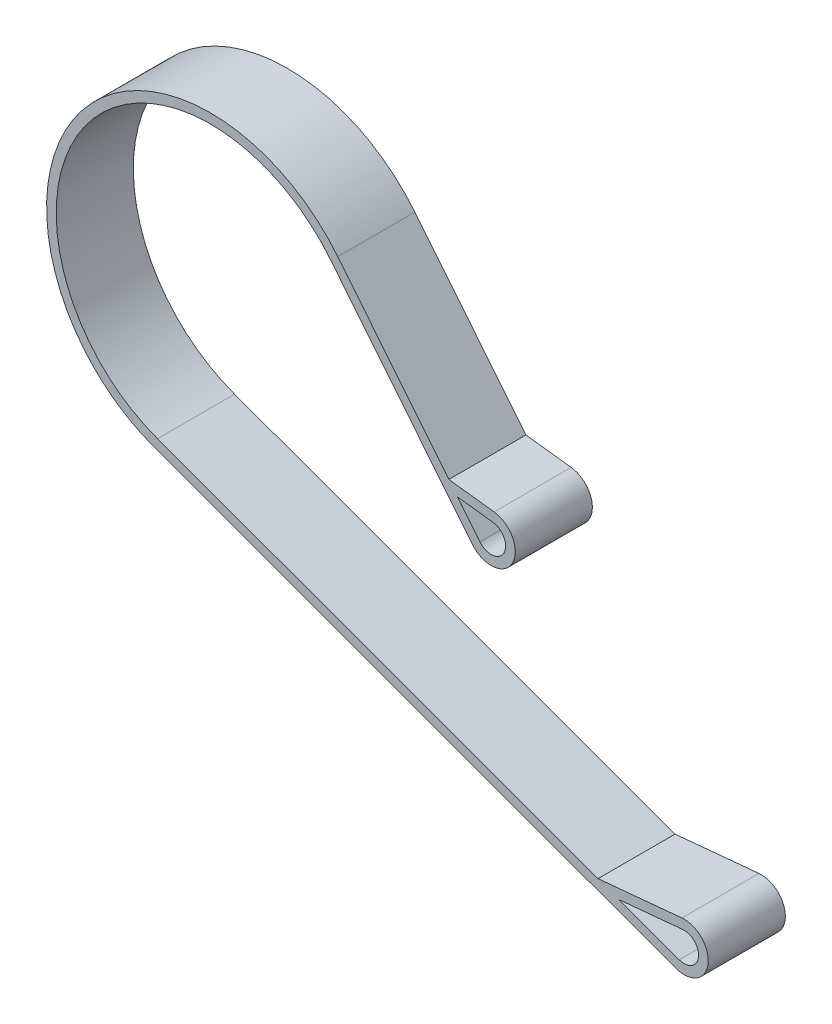
ISO-10303-21;
HEADER;
FILE_DESCRIPTION(('STEP AP214'),'2;1');
FILE_NAME('part.step','',(''),(''),'','','');
FILE_SCHEMA(('AUTOMOTIVE_DESIGN { 1 0 10303 214 1 1 1 1 }'));
ENDSEC;
DATA;
#1=APPLICATION_CONTEXT('core data for automotive mechanical design processes');
#2=APPLICATION_PROTOCOL_DEFINITION('international standard','automotive_design',2000,#1);
#3=PRODUCT_CONTEXT('',#1,'mechanical');
#4=PRODUCT('Part','Part','',(#3));
#5=PRODUCT_RELATED_PRODUCT_CATEGORY('part','',(#4));
#6=PRODUCT_DEFINITION_FORMATION('','',#4);
#7=PRODUCT_DEFINITION_CONTEXT('part definition',#1,'design');
#8=PRODUCT_DEFINITION('design','',#6,#7);
#9=PRODUCT_DEFINITION_SHAPE('','',#8);
#10=(LENGTH_UNIT() NAMED_UNIT(*) SI_UNIT(.MILLI.,.METRE.));
#11=(NAMED_UNIT(*) PLANE_ANGLE_UNIT() SI_UNIT($,.RADIAN.));
#12=(NAMED_UNIT(*) SI_UNIT($,.STERADIAN.) SOLID_ANGLE_UNIT());
#13=UNCERTAINTY_MEASURE_WITH_UNIT(LENGTH_MEASURE(1.E-05),#10,'distance_accuracy_value','');
#14=(GEOMETRIC_REPRESENTATION_CONTEXT(3) GLOBAL_UNCERTAINTY_ASSIGNED_CONTEXT((#13)) GLOBAL_UNIT_ASSIGNED_CONTEXT((#10,
#11,#12)) REPRESENTATION_CONTEXT('',''));
#15=CARTESIAN_POINT('',(0.,0.,0.));
#16=DIRECTION('',(0.,0.,1.));
#17=DIRECTION('',(1.,0.,0.));
#18=AXIS2_PLACEMENT_3D('',#15,#16,#17);
#19=CARTESIAN_POINT('',(-302.042094367227,-513.78392428085,25.4));
#20=DIRECTION('',(0.342935108897549,0.939359095918822,0.));
#21=DIRECTION('',(-0.939359095918822,0.342935108897549,0.));
#22=AXIS2_PLACEMENT_3D('',#19,#20,#21);
#23=PLANE('',#22);
#24=DIRECTION('',(0.939359095918822,-0.342935108897549,0.));
#25=VECTOR('',#24,1.);
#26=CARTESIAN_POINT('',(-302.042094367227,-513.78392428085,0.));
#27=LINE('',#26,#25);
#28=CARTESIAN_POINT('',(-149.967144558196,-569.302457821357,0.));
#29=VERTEX_POINT('',#28);
#30=CARTESIAN_POINT('',(-130.145681642796,-576.538748578463,0.));
#31=VERTEX_POINT('',#30);
#32=EDGE_CURVE('E171',#29,#31,#27,.T.);
#33=ORIENTED_EDGE('',*,*,#32,.F.);
#34=DIRECTION('',(0.,0.,-1.));
#35=VECTOR('',#34,1.);
#36=CARTESIAN_POINT('',(-149.967144558196,-569.302457821357,0.));
#37=LINE('',#36,#35);
#38=CARTESIAN_POINT('',(-149.967144558196,-569.302457821357,25.4));
#39=VERTEX_POINT('',#38);
#40=EDGE_CURVE('E155',#39,#29,#37,.T.);
#41=ORIENTED_EDGE('',*,*,#40,.F.);
#42=DIRECTION('',(0.939359095918822,-0.342935108897549,0.));
#43=VECTOR('',#42,1.);
#44=CARTESIAN_POINT('',(-302.042094367227,-513.78392428085,25.4));
#45=LINE('',#44,#43);
#46=CARTESIAN_POINT('',(-130.145681642796,-576.538748578463,25.4));
#47=VERTEX_POINT('',#46);
#48=EDGE_CURVE('E254',#39,#47,#45,.T.);
#49=ORIENTED_EDGE('',*,*,#48,.T.);
#50=DIRECTION('',(0.,0.,-1.));
#51=VECTOR('',#50,1.);
#52=CARTESIAN_POINT('',(-130.145681642796,-576.538748578463,25.4));
#53=LINE('',#52,#51);
#54=EDGE_CURVE('E217',#47,#31,#53,.T.);
#55=ORIENTED_EDGE('',*,*,#54,.T.);
#56=EDGE_LOOP('',(#33,#41,#49,#55));
#57=FACE_BOUND('',#56,.T.);
#58=ADVANCED_FACE('F33',(#57),#23,.T.);
#59=CARTESIAN_POINT('',(-302.042094367227,-513.78392428085,25.4));
#60=VERTEX_POINT('',#59);
#61=CARTESIAN_POINT('',(-156.910869565258,-566.767487859606,25.4));
#62=VERTEX_POINT('',#61);
#63=EDGE_CURVE('E164',#60,#62,#45,.T.);
#64=ORIENTED_EDGE('',*,*,#63,.T.);
#65=DIRECTION('',(0.,0.,1.));
#66=VECTOR('',#65,1.);
#67=CARTESIAN_POINT('',(-156.910869565258,-566.767487859606,25.4));
#68=LINE('',#67,#66);
#69=CARTESIAN_POINT('',(-156.910869565258,-566.767487859606,0.));
#70=VERTEX_POINT('',#69);
#71=EDGE_CURVE('E148',#70,#62,#68,.T.);
#72=ORIENTED_EDGE('',*,*,#71,.F.);
#73=CARTESIAN_POINT('',(-302.042094367227,-513.78392428085,0.));
#74=VERTEX_POINT('',#73);
#75=EDGE_CURVE('E161',#74,#70,#27,.T.);
#76=ORIENTED_EDGE('',*,*,#75,.F.);
#77=DIRECTION('',(0.,0.,-1.));
#78=VECTOR('',#77,1.);
#79=CARTESIAN_POINT('',(-302.042094367227,-513.78392428085,25.4));
#80=LINE('',#79,#78);
#81=EDGE_CURVE('E215',#60,#74,#80,.T.);
#82=ORIENTED_EDGE('',*,*,#81,.F.);
#83=EDGE_LOOP('',(#64,#72,#76,#82));
#84=FACE_BOUND('',#83,.T.);
#85=ADVANCED_FACE('F160',(#84),#23,.T.);
#86=CARTESIAN_POINT('',(-242.638589895451,-432.141353868772,25.4));
#87=DIRECTION('',(-0.777811967388241,-0.628497051216339,0.));
#88=DIRECTION('',(0.62849705121634,-0.777811967388241,0.));
#89=AXIS2_PLACEMENT_3D('',#86,#87,#88);
#90=PLANE('',#89);
#91=DIRECTION('',(0.,0.,-1.));
#92=VECTOR('',#91,1.);
#93=CARTESIAN_POINT('',(-206.046345314142,-477.426985191714,25.4));
#94=LINE('',#93,#92);
#95=CARTESIAN_POINT('',(-206.046345314142,-477.426985191714,25.4));
#96=VERTEX_POINT('',#95);
#97=CARTESIAN_POINT('',(-206.046345314142,-477.426985191714,0.));
#98=VERTEX_POINT('',#97);
#99=EDGE_CURVE('E260',#96,#98,#94,.T.);
#100=ORIENTED_EDGE('',*,*,#99,.T.);
#101=DIRECTION('',(-0.62849705121634,0.777811967388241,0.));
#102=VECTOR('',#101,1.);
#103=CARTESIAN_POINT('',(-242.638589895451,-432.141353868772,0.));
#104=LINE('',#103,#102);
#105=CARTESIAN_POINT('',(-242.638589895451,-432.141353868772,0.));
#106=VERTEX_POINT('',#105);
#107=EDGE_CURVE('E185',#98,#106,#104,.T.);
#108=ORIENTED_EDGE('',*,*,#107,.T.);
#109=DIRECTION('',(0.,0.,-1.));
#110=VECTOR('',#109,1.);
#111=CARTESIAN_POINT('',(-242.638589895451,-432.141353868772,25.4));
#112=LINE('',#111,#110);
#113=CARTESIAN_POINT('',(-242.638589895451,-432.141353868772,25.4));
#114=VERTEX_POINT('',#113);
#115=EDGE_CURVE('E200',#114,#106,#112,.T.);
#116=ORIENTED_EDGE('',*,*,#115,.F.);
#117=DIRECTION('',(-0.62849705121634,0.777811967388241,0.));
#118=VECTOR('',#117,1.);
#119=CARTESIAN_POINT('',(-242.638589895451,-432.141353868772,25.4));
#120=LINE('',#119,#118);
#121=EDGE_CURVE('E56',#96,#114,#120,.T.);
#122=ORIENTED_EDGE('',*,*,#121,.F.);
#123=EDGE_LOOP('',(#100,#108,#116,#122));
#124=FACE_BOUND('',#123,.T.);
#125=ADVANCED_FACE('F317',(#124),#90,.F.);
#126=DIRECTION('',(0.,0.,1.));
#127=VECTOR('',#126,1.);
#128=CARTESIAN_POINT('',(-203.182116863291,-480.971681482802,0.));
#129=LINE('',#128,#127);
#130=CARTESIAN_POINT('',(-203.182116863291,-480.971681482802,0.));
#131=VERTEX_POINT('',#130);
#132=CARTESIAN_POINT('',(-203.182116863291,-480.971681482802,25.4));
#133=VERTEX_POINT('',#132);
#134=EDGE_CURVE('E258',#131,#133,#129,.T.);
#135=ORIENTED_EDGE('',*,*,#134,.T.);
#136=CARTESIAN_POINT('',(-195.803695157006,-490.103028547166,25.4));
#137=VERTEX_POINT('',#136);
#138=EDGE_CURVE('E239',#137,#133,#120,.T.);
#139=ORIENTED_EDGE('',*,*,#138,.F.);
#140=DIRECTION('',(0.,0.,-1.));
#141=VECTOR('',#140,1.);
#142=CARTESIAN_POINT('',(-195.803695157006,-490.103028547166,25.4));
#143=LINE('',#142,#141);
#144=CARTESIAN_POINT('',(-195.803695157006,-490.103028547166,0.));
#145=VERTEX_POINT('',#144);
#146=EDGE_CURVE('E203',#137,#145,#143,.T.);
#147=ORIENTED_EDGE('',*,*,#146,.T.);
#148=EDGE_CURVE('E186',#145,#131,#104,.T.);
#149=ORIENTED_EDGE('',*,*,#148,.T.);
#150=EDGE_LOOP('',(#135,#139,#147,#149));
#151=FACE_BOUND('',#150,.T.);
#152=ADVANCED_FACE('F300',(#151),#90,.F.);
#153=CARTESIAN_POINT('',(-128.512453186671,-572.06505088415,25.4));
#154=DIRECTION('',(0.,0.,-1.));
#155=DIRECTION('',(-1.,0.,0.));
#156=AXIS2_PLACEMENT_3D('',#153,#154,#155);
#157=CYLINDRICAL_SURFACE('',#156,7.93750000000008);
#158=CARTESIAN_POINT('',(-128.512453186671,-572.06505088415,0.));
#159=DIRECTION('',(0.,0.,1.));
#160=DIRECTION('',(1.,0.,0.));
#161=AXIS2_PLACEMENT_3D('',#158,#159,#160);
#162=CIRCLE('',#161,7.93750000000008);
#163=CARTESIAN_POINT('',(-131.234500613546,-579.521213708006,0.));
#164=VERTEX_POINT('',#163);
#165=CARTESIAN_POINT('',(-129.256854736989,-564.162534033052,0.));
#166=VERTEX_POINT('',#165);
#167=EDGE_CURVE('E230',#164,#166,#162,.T.);
#168=ORIENTED_EDGE('',*,*,#167,.T.);
#169=DIRECTION('',(0.,0.,-1.));
#170=VECTOR('',#169,1.);
#171=CARTESIAN_POINT('',(-129.256854736989,-564.162534033052,25.4));
#172=LINE('',#171,#170);
#173=CARTESIAN_POINT('',(-129.256854736989,-564.162534033052,25.4));
#174=VERTEX_POINT('',#173);
#175=EDGE_CURVE('E11',#174,#166,#172,.T.);
#176=ORIENTED_EDGE('',*,*,#175,.F.);
#177=CARTESIAN_POINT('',(-128.512453186671,-572.06505088415,25.4));
#178=DIRECTION('',(0.,0.,1.));
#179=DIRECTION('',(1.,0.,0.));
#180=AXIS2_PLACEMENT_3D('',#177,#178,#179);
#181=CIRCLE('',#180,7.93750000000008);
#182=CARTESIAN_POINT('',(-131.234500613546,-579.521213708006,25.4));
#183=VERTEX_POINT('',#182);
#184=EDGE_CURVE('E192',#183,#174,#181,.T.);
#185=ORIENTED_EDGE('',*,*,#184,.F.);
#186=DIRECTION('',(0.,0.,-1.));
#187=VECTOR('',#186,1.);
#188=CARTESIAN_POINT('',(-131.234500613546,-579.521213708006,25.4));
#189=LINE('',#188,#187);
#190=EDGE_CURVE('E193',#183,#164,#189,.T.);
#191=ORIENTED_EDGE('',*,*,#190,.T.);
#192=EDGE_LOOP('',(#168,#176,#185,#191));
#193=FACE_BOUND('',#192,.T.);
#194=ADVANCED_FACE('F35',(#193),#157,.T.);
#195=CARTESIAN_POINT('',(-128.512453186671,-572.06505088415,25.4));
#196=DIRECTION('',(0.,0.,-1.));
#197=DIRECTION('',(-1.,0.,0.));
#198=AXIS2_PLACEMENT_3D('',#195,#196,#197);
#199=CYLINDRICAL_SURFACE('',#198,4.76250000000008);
#200=CARTESIAN_POINT('',(-128.512453186671,-572.06505088415,0.));
#201=DIRECTION('',(0.,0.,1.));
#202=DIRECTION('',(1.,0.,0.));
#203=AXIS2_PLACEMENT_3D('',#200,#201,#202);
#204=CIRCLE('',#203,4.76250000000008);
#205=CARTESIAN_POINT('',(-128.959094116862,-567.323540773491,0.));
#206=VERTEX_POINT('',#205);
#207=EDGE_CURVE('E175',#31,#206,#204,.T.);
#208=ORIENTED_EDGE('',*,*,#207,.F.);
#209=ORIENTED_EDGE('',*,*,#54,.F.);
#210=CARTESIAN_POINT('',(-128.512453186671,-572.06505088415,25.4));
#211=DIRECTION('',(0.,0.,1.));
#212=DIRECTION('',(1.,0.,0.));
#213=AXIS2_PLACEMENT_3D('',#210,#211,#212);
#214=CIRCLE('',#213,4.76250000000008);
#215=CARTESIAN_POINT('',(-128.959094116862,-567.323540773491,25.4));
#216=VERTEX_POINT('',#215);
#217=EDGE_CURVE('E227',#47,#216,#214,.T.);
#218=ORIENTED_EDGE('',*,*,#217,.T.);
#219=DIRECTION('',(0.,0.,-1.));
#220=VECTOR('',#219,1.);
#221=CARTESIAN_POINT('',(-128.959094116862,-567.323540773491,25.4));
#222=LINE('',#221,#220);
#223=EDGE_CURVE('E41',#216,#206,#222,.T.);
#224=ORIENTED_EDGE('',*,*,#223,.T.);
#225=EDGE_LOOP('',(#208,#209,#218,#224));
#226=FACE_BOUND('',#225,.T.);
#227=ADVANCED_FACE('F224',(#226),#199,.F.);
#228=CARTESIAN_POINT('',(-284.620990835231,-466.064482208174,25.4));
#229=DIRECTION('',(0.,0.,-1.));
#230=DIRECTION('',(-1.,0.,0.));
#231=AXIS2_PLACEMENT_3D('',#228,#229,#230);
#232=CYLINDRICAL_SURFACE('',#231,50.7999999999997);
#233=CARTESIAN_POINT('',(-284.620990835231,-466.064482208174,0.));
#234=DIRECTION('',(0.,0.,1.));
#235=DIRECTION('',(1.,0.,0.));
#236=AXIS2_PLACEMENT_3D('',#233,#234,#235);
#237=CIRCLE('',#236,50.7999999999997);
#238=CARTESIAN_POINT('',(-245.108142891909,-434.136832006384,0.));
#239=VERTEX_POINT('',#238);
#240=EDGE_CURVE('E170',#239,#74,#237,.T.);
#241=ORIENTED_EDGE('',*,*,#240,.F.);
#242=DIRECTION('',(0.,0.,-1.));
#243=VECTOR('',#242,1.);
#244=CARTESIAN_POINT('',(-245.108142891909,-434.136832006384,25.4));
#245=LINE('',#244,#243);
#246=CARTESIAN_POINT('',(-245.108142891909,-434.136832006384,25.4));
#247=VERTEX_POINT('',#246);
#248=EDGE_CURVE('E213',#247,#239,#245,.T.);
#249=ORIENTED_EDGE('',*,*,#248,.F.);
#250=CARTESIAN_POINT('',(-284.620990835231,-466.064482208174,25.4));
#251=DIRECTION('',(0.,0.,1.));
#252=DIRECTION('',(1.,0.,0.));
#253=AXIS2_PLACEMENT_3D('',#250,#251,#252);
#254=CIRCLE('',#253,50.7999999999997);
#255=EDGE_CURVE('E250',#247,#60,#254,.T.);
#256=ORIENTED_EDGE('',*,*,#255,.T.);
#257=ORIENTED_EDGE('',*,*,#81,.T.);
#258=EDGE_LOOP('',(#241,#249,#256,#257));
#259=FACE_BOUND('',#258,.T.);
#260=ADVANCED_FACE('F319',(#259),#232,.F.);
#261=CARTESIAN_POINT('',(-245.108142891909,-434.136832006384,25.4));
#262=DIRECTION('',(-0.777811967388241,-0.628497051216339,0.));
#263=DIRECTION('',(0.62849705121634,-0.777811967388241,0.));
#264=AXIS2_PLACEMENT_3D('',#261,#262,#263);
#265=PLANE('',#264);
#266=DIRECTION('',(-0.628497051216339,0.777811967388241,0.));
#267=VECTOR('',#266,1.);
#268=CARTESIAN_POINT('',(-245.108142891909,-434.136832006384,0.));
#269=LINE('',#268,#267);
#270=CARTESIAN_POINT('',(-198.273248153464,-492.098506684778,0.));
#271=VERTEX_POINT('',#270);
#272=EDGE_CURVE('E173',#271,#239,#269,.T.);
#273=ORIENTED_EDGE('',*,*,#272,.F.);
#274=DIRECTION('',(0.,0.,-1.));
#275=VECTOR('',#274,1.);
#276=CARTESIAN_POINT('',(-198.273248153464,-492.098506684778,25.4));
#277=LINE('',#276,#275);
#278=CARTESIAN_POINT('',(-198.273248153464,-492.098506684778,25.4));
#279=VERTEX_POINT('',#278);
#280=EDGE_CURVE('E211',#279,#271,#277,.T.);
#281=ORIENTED_EDGE('',*,*,#280,.F.);
#282=DIRECTION('',(-0.628497051216339,0.777811967388241,0.));
#283=VECTOR('',#282,1.);
#284=CARTESIAN_POINT('',(-245.108142891909,-434.136832006384,25.4));
#285=LINE('',#284,#283);
#286=EDGE_CURVE('E247',#279,#247,#285,.T.);
#287=ORIENTED_EDGE('',*,*,#286,.T.);
#288=ORIENTED_EDGE('',*,*,#248,.T.);
#289=EDGE_LOOP('',(#273,#281,#287,#288));
#290=FACE_BOUND('',#289,.T.);
#291=ADVANCED_FACE('F326',(#290),#265,.T.);
#292=CARTESIAN_POINT('',(-192.099365662319,-487.109811340748,25.4));
#293=DIRECTION('',(0.,0.,-1.));
#294=DIRECTION('',(-1.,0.,0.));
#295=AXIS2_PLACEMENT_3D('',#292,#293,#294);
#296=CYLINDRICAL_SURFACE('',#295,7.93750000000003);
#297=CARTESIAN_POINT('',(-192.099365662319,-487.109811340748,0.));
#298=DIRECTION('',(0.,0.,-1.));
#299=DIRECTION('',(1.,0.,0.));
#300=AXIS2_PLACEMENT_3D('',#297,#298,#299);
#301=CIRCLE('',#300,7.93750000000003);
#302=CARTESIAN_POINT('',(-191.145962890009,-479.229777749211,0.));
#303=VERTEX_POINT('',#302);
#304=EDGE_CURVE('E180',#303,#271,#301,.T.);
#305=ORIENTED_EDGE('',*,*,#304,.F.);
#306=DIRECTION('',(0.,0.,-1.));
#307=VECTOR('',#306,1.);
#308=CARTESIAN_POINT('',(-191.145962890009,-479.229777749211,25.4));
#309=LINE('',#308,#307);
#310=CARTESIAN_POINT('',(-191.145962890009,-479.229777749211,25.4));
#311=VERTEX_POINT('',#310);
#312=EDGE_CURVE('E209',#311,#303,#309,.T.);
#313=ORIENTED_EDGE('',*,*,#312,.F.);
#314=CARTESIAN_POINT('',(-192.099365662319,-487.109811340748,25.4));
#315=DIRECTION('',(0.,0.,-1.));
#316=DIRECTION('',(1.,0.,0.));
#317=AXIS2_PLACEMENT_3D('',#314,#315,#316);
#318=CIRCLE('',#317,7.93750000000003);
#319=EDGE_CURVE('E244',#311,#279,#318,.T.);
#320=ORIENTED_EDGE('',*,*,#319,.T.);
#321=ORIENTED_EDGE('',*,*,#280,.T.);
#322=EDGE_LOOP('',(#305,#313,#320,#321));
#323=FACE_BOUND('',#322,.T.);
#324=ADVANCED_FACE('F340',(#323),#296,.T.);
#325=CARTESIAN_POINT('',(-192.099365662319,-487.109811340748,25.4));
#326=DIRECTION('',(0.,0.,-1.));
#327=DIRECTION('',(-1.,0.,0.));
#328=AXIS2_PLACEMENT_3D('',#325,#326,#327);
#329=CYLINDRICAL_SURFACE('',#328,4.76250000000003);
#330=CARTESIAN_POINT('',(-192.099365662319,-487.109811340748,0.));
#331=DIRECTION('',(0.,0.,1.));
#332=DIRECTION('',(1.,0.,0.));
#333=AXIS2_PLACEMENT_3D('',#330,#331,#332);
#334=CIRCLE('',#333,4.76250000000003);
#335=CARTESIAN_POINT('',(-191.527323998933,-482.381791185826,0.));
#336=VERTEX_POINT('',#335);
#337=EDGE_CURVE('E183',#336,#145,#334,.F.);
#338=ORIENTED_EDGE('',*,*,#337,.T.);
#339=ORIENTED_EDGE('',*,*,#146,.F.);
#340=CARTESIAN_POINT('',(-192.099365662319,-487.109811340748,25.4));
#341=DIRECTION('',(0.,0.,1.));
#342=DIRECTION('',(1.,0.,0.));
#343=AXIS2_PLACEMENT_3D('',#340,#341,#342);
#344=CIRCLE('',#343,4.76250000000003);
#345=CARTESIAN_POINT('',(-191.527323998933,-482.381791185826,25.4));
#346=VERTEX_POINT('',#345);
#347=EDGE_CURVE('E242',#346,#137,#344,.F.);
#348=ORIENTED_EDGE('',*,*,#347,.F.);
#349=DIRECTION('',(0.,0.,-1.));
#350=VECTOR('',#349,1.);
#351=CARTESIAN_POINT('',(-191.527323998933,-482.381791185826,25.4));
#352=LINE('',#351,#350);
#353=EDGE_CURVE('E206',#346,#336,#352,.T.);
#354=ORIENTED_EDGE('',*,*,#353,.T.);
#355=EDGE_LOOP('',(#338,#339,#348,#354));
#356=FACE_BOUND('',#355,.T.);
#357=ADVANCED_FACE('F298',(#356),#329,.F.);
#358=CARTESIAN_POINT('',(-284.620990835231,-466.064482208174,25.4));
#359=DIRECTION('',(0.,0.,-1.));
#360=DIRECTION('',(-1.,0.,0.));
#361=AXIS2_PLACEMENT_3D('',#358,#359,#360);
#362=CYLINDRICAL_SURFACE('',#361,53.9749999999997);
#363=CARTESIAN_POINT('',(-284.620990835231,-466.064482208174,0.));
#364=DIRECTION('',(0.,0.,1.));
#365=DIRECTION('',(1.,0.,0.));
#366=AXIS2_PLACEMENT_3D('',#363,#364,#365);
#367=CIRCLE('',#366,53.9749999999997);
#368=CARTESIAN_POINT('',(-303.130913337977,-516.766389410392,0.));
#369=VERTEX_POINT('',#368);
#370=EDGE_CURVE('E188',#106,#369,#367,.T.);
#371=ORIENTED_EDGE('',*,*,#370,.T.);
#372=DIRECTION('',(0.,0.,-1.));
#373=VECTOR('',#372,1.);
#374=CARTESIAN_POINT('',(-303.130913337977,-516.766389410392,25.4));
#375=LINE('',#374,#373);
#376=CARTESIAN_POINT('',(-303.130913337977,-516.766389410392,25.4));
#377=VERTEX_POINT('',#376);
#378=EDGE_CURVE('E196',#377,#369,#375,.T.);
#379=ORIENTED_EDGE('',*,*,#378,.F.);
#380=CARTESIAN_POINT('',(-284.620990835231,-466.064482208174,25.4));
#381=DIRECTION('',(0.,0.,1.));
#382=DIRECTION('',(1.,0.,0.));
#383=AXIS2_PLACEMENT_3D('',#380,#381,#382);
#384=CIRCLE('',#383,53.9749999999997);
#385=EDGE_CURVE('E237',#114,#377,#384,.T.);
#386=ORIENTED_EDGE('',*,*,#385,.F.);
#387=ORIENTED_EDGE('',*,*,#115,.T.);
#388=EDGE_LOOP('',(#371,#379,#386,#387));
#389=FACE_BOUND('',#388,.T.);
#390=ADVANCED_FACE('F337',(#389),#362,.T.);
#391=CARTESIAN_POINT('',(-303.130913337977,-516.766389410392,25.4));
#392=DIRECTION('',(0.342935108897549,0.939359095918822,0.));
#393=DIRECTION('',(-0.939359095918822,0.342935108897549,0.));
#394=AXIS2_PLACEMENT_3D('',#391,#392,#393);
#395=PLANE('',#394);
#396=DIRECTION('',(0.939359095918822,-0.342935108897549,0.));
#397=VECTOR('',#396,1.);
#398=CARTESIAN_POINT('',(-303.130913337977,-516.766389410392,0.));
#399=LINE('',#398,#397);
#400=EDGE_CURVE('E190',#369,#164,#399,.T.);
#401=ORIENTED_EDGE('',*,*,#400,.T.);
#402=ORIENTED_EDGE('',*,*,#190,.F.);
#403=DIRECTION('',(0.939359095918822,-0.342935108897549,0.));
#404=VECTOR('',#403,1.);
#405=CARTESIAN_POINT('',(-303.130913337977,-516.766389410392,25.4));
#406=LINE('',#405,#404);
#407=EDGE_CURVE('E197',#377,#183,#406,.T.);
#408=ORIENTED_EDGE('',*,*,#407,.F.);
#409=ORIENTED_EDGE('',*,*,#378,.T.);
#410=EDGE_LOOP('',(#401,#402,#408,#409));
#411=FACE_BOUND('',#410,.T.);
#412=ADVANCED_FACE('F281',(#411),#395,.F.);
#413=CARTESIAN_POINT('',(-128.512453186671,-572.06505088415,25.4));
#414=DIRECTION('',(0.,0.,1.));
#415=DIRECTION('',(1.,0.,0.));
#416=AXIS2_PLACEMENT_3D('',#413,#414,#415);
#417=PLANE('',#416);
#418=ORIENTED_EDGE('',*,*,#48,.F.);
#419=DIRECTION('',(0.995592674154052,0.0937828724809822,0.));
#420=VECTOR('',#419,1.);
#421=CARTESIAN_POINT('',(-327.536503064164,-586.029142275363,25.4));
#422=LINE('',#421,#420);
#423=EDGE_CURVE('E270',#39,#216,#422,.T.);
#424=ORIENTED_EDGE('',*,*,#423,.T.);
#425=ORIENTED_EDGE('',*,*,#217,.F.);
#426=EDGE_LOOP('',(#418,#424,#425));
#427=FACE_BOUND('',#426,.T.);
#428=DIRECTION('',(0.992760137516475,-0.120113735094157,0.));
#429=VECTOR('',#428,1.);
#430=CARTESIAN_POINT('',(-338.428495821406,-461.410110665504,25.4));
#431=LINE('',#430,#429);
#432=EDGE_CURVE('E231',#96,#311,#431,.T.);
#433=ORIENTED_EDGE('',*,*,#432,.F.);
#434=ORIENTED_EDGE('',*,*,#121,.T.);
#435=ORIENTED_EDGE('',*,*,#385,.T.);
#436=ORIENTED_EDGE('',*,*,#407,.T.);
#437=ORIENTED_EDGE('',*,*,#184,.T.);
#438=DIRECTION('',(0.995592674154052,0.0937828724809822,0.));
#439=VECTOR('',#438,1.);
#440=CARTESIAN_POINT('',(-327.834263684291,-582.868135534924,25.4));
#441=LINE('',#440,#439);
#442=EDGE_CURVE('E261',#62,#174,#441,.T.);
#443=ORIENTED_EDGE('',*,*,#442,.F.);
#444=ORIENTED_EDGE('',*,*,#63,.F.);
#445=ORIENTED_EDGE('',*,*,#255,.F.);
#446=ORIENTED_EDGE('',*,*,#286,.F.);
#447=ORIENTED_EDGE('',*,*,#319,.F.);
#448=EDGE_LOOP('',(#433,#434,#435,#436,#437,#443,#444,#445,#446,#447));
#449=FACE_BOUND('',#448,.T.);
#450=ORIENTED_EDGE('',*,*,#138,.T.);
#451=DIRECTION('',(0.992760137516475,-0.120113735094157,0.));
#452=VECTOR('',#451,1.);
#453=CARTESIAN_POINT('',(-338.80985693033,-464.562124102119,25.4));
#454=LINE('',#453,#452);
#455=EDGE_CURVE('E233',#133,#346,#454,.T.);
#456=ORIENTED_EDGE('',*,*,#455,.T.);
#457=ORIENTED_EDGE('',*,*,#347,.T.);
#458=EDGE_LOOP('',(#450,#456,#457));
#459=FACE_BOUND('',#458,.T.);
#460=ADVANCED_FACE('F278',(#427,#449,#459),#417,.T.);
#461=CARTESIAN_POINT('',(-128.512453186671,-572.06505088415,0.));
#462=DIRECTION('',(0.,0.,1.));
#463=DIRECTION('',(1.,0.,0.));
#464=AXIS2_PLACEMENT_3D('',#461,#462,#463);
#465=PLANE('',#464);
#466=DIRECTION('',(0.995592674154052,0.0937828724809822,0.));
#467=VECTOR('',#466,1.);
#468=CARTESIAN_POINT('',(-327.536503064164,-586.029142275363,0.));
#469=LINE('',#468,#467);
#470=EDGE_CURVE('E48',#29,#206,#469,.T.);
#471=ORIENTED_EDGE('',*,*,#470,.F.);
#472=ORIENTED_EDGE('',*,*,#32,.T.);
#473=ORIENTED_EDGE('',*,*,#207,.T.);
#474=EDGE_LOOP('',(#471,#472,#473));
#475=FACE_BOUND('',#474,.T.);
#476=ORIENTED_EDGE('',*,*,#107,.F.);
#477=DIRECTION('',(0.992760137516475,-0.120113735094157,0.));
#478=VECTOR('',#477,1.);
#479=CARTESIAN_POINT('',(-338.428495821406,-461.410110665504,0.));
#480=LINE('',#479,#478);
#481=EDGE_CURVE('E263',#98,#303,#480,.T.);
#482=ORIENTED_EDGE('',*,*,#481,.T.);
#483=ORIENTED_EDGE('',*,*,#304,.T.);
#484=ORIENTED_EDGE('',*,*,#272,.T.);
#485=ORIENTED_EDGE('',*,*,#240,.T.);
#486=ORIENTED_EDGE('',*,*,#75,.T.);
#487=DIRECTION('',(0.995592674154052,0.0937828724809822,0.));
#488=VECTOR('',#487,1.);
#489=CARTESIAN_POINT('',(-327.834263684291,-582.868135534924,0.));
#490=LINE('',#489,#488);
#491=EDGE_CURVE('E145',#70,#166,#490,.T.);
#492=ORIENTED_EDGE('',*,*,#491,.T.);
#493=ORIENTED_EDGE('',*,*,#167,.F.);
#494=ORIENTED_EDGE('',*,*,#400,.F.);
#495=ORIENTED_EDGE('',*,*,#370,.F.);
#496=EDGE_LOOP('',(#476,#482,#483,#484,#485,#486,#492,#493,#494,#495));
#497=FACE_BOUND('',#496,.T.);
#498=DIRECTION('',(0.992760137516475,-0.120113735094157,0.));
#499=VECTOR('',#498,1.);
#500=CARTESIAN_POINT('',(-338.80985693033,-464.562124102119,0.));
#501=LINE('',#500,#499);
#502=EDGE_CURVE('E266',#131,#336,#501,.T.);
#503=ORIENTED_EDGE('',*,*,#502,.F.);
#504=ORIENTED_EDGE('',*,*,#148,.F.);
#505=ORIENTED_EDGE('',*,*,#337,.F.);
#506=EDGE_LOOP('',(#503,#504,#505));
#507=FACE_BOUND('',#506,.T.);
#508=ADVANCED_FACE('F166',(#475,#497,#507),#465,.F.);
#509=CARTESIAN_POINT('',(-338.428495821406,-461.410110665504,25.4));
#510=DIRECTION('',(-0.120113735094157,-0.992760137516475,0.));
#511=DIRECTION('',(0.992760137516475,-0.120113735094157,0.));
#512=AXIS2_PLACEMENT_3D('',#509,#510,#511);
#513=PLANE('',#512);
#514=ORIENTED_EDGE('',*,*,#99,.F.);
#515=ORIENTED_EDGE('',*,*,#432,.T.);
#516=ORIENTED_EDGE('',*,*,#312,.T.);
#517=ORIENTED_EDGE('',*,*,#481,.F.);
#518=EDGE_LOOP('',(#514,#515,#516,#517));
#519=FACE_BOUND('',#518,.T.);
#520=ADVANCED_FACE('F302',(#519),#513,.F.);
#521=CARTESIAN_POINT('',(-338.80985693033,-464.562124102119,0.));
#522=DIRECTION('',(0.120113735094157,0.992760137516475,0.));
#523=DIRECTION('',(-0.992760137516475,0.120113735094157,0.));
#524=AXIS2_PLACEMENT_3D('',#521,#522,#523);
#525=PLANE('',#524);
#526=ORIENTED_EDGE('',*,*,#134,.F.);
#527=ORIENTED_EDGE('',*,*,#502,.T.);
#528=ORIENTED_EDGE('',*,*,#353,.F.);
#529=ORIENTED_EDGE('',*,*,#455,.F.);
#530=EDGE_LOOP('',(#526,#527,#528,#529));
#531=FACE_BOUND('',#530,.T.);
#532=ADVANCED_FACE('F294',(#531),#525,.F.);
#533=CARTESIAN_POINT('',(-327.536503064164,-586.029142275363,0.));
#534=DIRECTION('',(-0.0937828724809822,0.995592674154052,0.));
#535=DIRECTION('',(-0.995592674154052,-0.0937828724809822,0.));
#536=AXIS2_PLACEMENT_3D('',#533,#534,#535);
#537=PLANE('',#536);
#538=ORIENTED_EDGE('',*,*,#423,.F.);
#539=ORIENTED_EDGE('',*,*,#40,.T.);
#540=ORIENTED_EDGE('',*,*,#470,.T.);
#541=ORIENTED_EDGE('',*,*,#223,.F.);
#542=EDGE_LOOP('',(#538,#539,#540,#541));
#543=FACE_BOUND('',#542,.T.);
#544=ADVANCED_FACE('F274',(#543),#537,.F.);
#545=CARTESIAN_POINT('',(-327.834263684291,-582.868135534924,25.4));
#546=DIRECTION('',(0.0937828724809822,-0.995592674154052,0.));
#547=DIRECTION('',(0.995592674154052,0.0937828724809822,0.));
#548=AXIS2_PLACEMENT_3D('',#545,#546,#547);
#549=PLANE('',#548);
#550=ORIENTED_EDGE('',*,*,#491,.F.);
#551=ORIENTED_EDGE('',*,*,#71,.T.);
#552=ORIENTED_EDGE('',*,*,#442,.T.);
#553=ORIENTED_EDGE('',*,*,#175,.T.);
#554=EDGE_LOOP('',(#550,#551,#552,#553));
#555=FACE_BOUND('',#554,.T.);
#556=ADVANCED_FACE('F147',(#555),#549,.F.);
#557=CLOSED_SHELL('',(#58,#85,#125,#152,#194,#227,#260,#291,#324,#357,#390,#412,#460,#508,#520,
#532,#544,#556));
#558=MANIFOLD_SOLID_BREP('B2',#557);
#559=ADVANCED_BREP_SHAPE_REPRESENTATION('',(#18,#558),#14);
#560=SHAPE_DEFINITION_REPRESENTATION(#9,#559);
ENDSEC;
END-ISO-10303-21;
